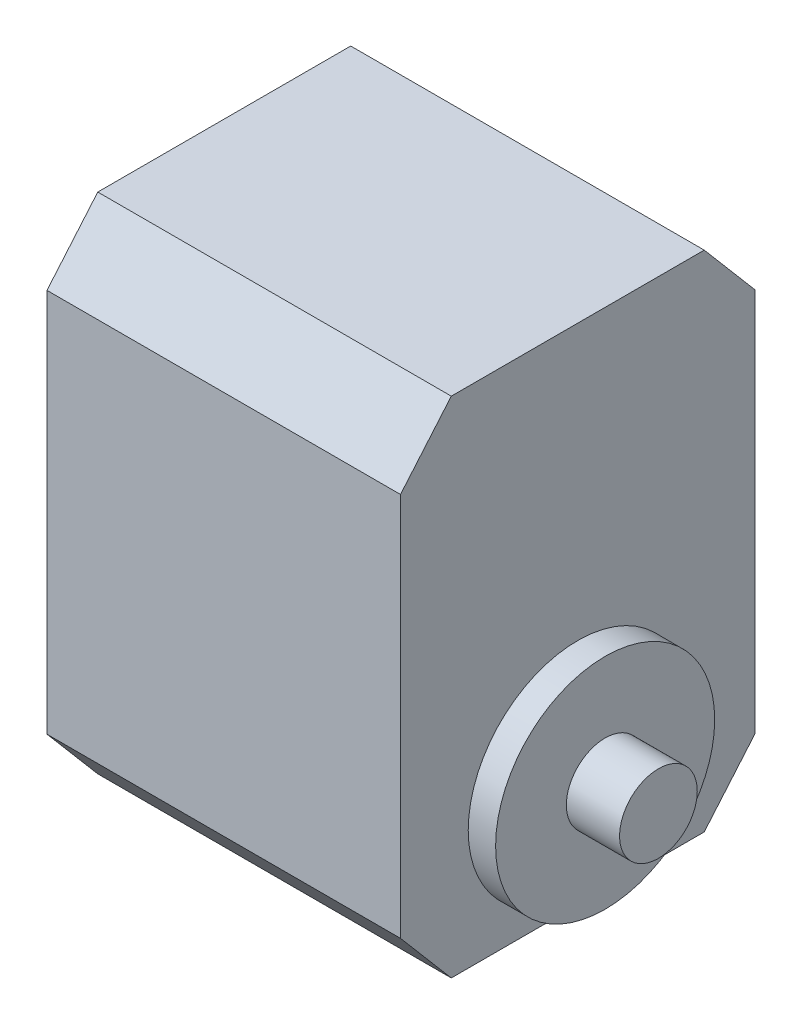
ISO-10303-21;
HEADER;
FILE_DESCRIPTION(('STEP AP214'),'2;1');
FILE_NAME('part.step','',(''),(''),'','','');
FILE_SCHEMA(('AUTOMOTIVE_DESIGN { 1 0 10303 214 1 1 1 1 }'));
ENDSEC;
DATA;
#1=APPLICATION_CONTEXT('core data for automotive mechanical design processes');
#2=APPLICATION_PROTOCOL_DEFINITION('international standard','automotive_design',2000,#1);
#3=PRODUCT_CONTEXT('',#1,'mechanical');
#4=PRODUCT('Part','Part','',(#3));
#5=PRODUCT_RELATED_PRODUCT_CATEGORY('part','',(#4));
#6=PRODUCT_DEFINITION_FORMATION('','',#4);
#7=PRODUCT_DEFINITION_CONTEXT('part definition',#1,'design');
#8=PRODUCT_DEFINITION('design','',#6,#7);
#9=PRODUCT_DEFINITION_SHAPE('','',#8);
#10=(LENGTH_UNIT() NAMED_UNIT(*) SI_UNIT(.MILLI.,.METRE.));
#11=(NAMED_UNIT(*) PLANE_ANGLE_UNIT() SI_UNIT($,.RADIAN.));
#12=(NAMED_UNIT(*) SI_UNIT($,.STERADIAN.) SOLID_ANGLE_UNIT());
#13=UNCERTAINTY_MEASURE_WITH_UNIT(LENGTH_MEASURE(1.E-05),#10,'distance_accuracy_value','');
#14=(GEOMETRIC_REPRESENTATION_CONTEXT(3) GLOBAL_UNCERTAINTY_ASSIGNED_CONTEXT((#13)) GLOBAL_UNIT_ASSIGNED_CONTEXT((#10,
#11,#12)) REPRESENTATION_CONTEXT('',''));
#15=CARTESIAN_POINT('',(0.,0.,0.));
#16=DIRECTION('',(0.,0.,1.));
#17=DIRECTION('',(1.,0.,0.));
#18=AXIS2_PLACEMENT_3D('',#15,#16,#17);
#19=CARTESIAN_POINT('',(17.75,38.6,17.8));
#20=DIRECTION('',(-1.,0.,0.));
#21=DIRECTION('',(0.,0.,1.));
#22=AXIS2_PLACEMENT_3D('',#19,#20,#21);
#23=PLANE('',#22);
#24=CARTESIAN_POINT('',(17.75,0.,0.));
#25=DIRECTION('',(-1.,0.,0.));
#26=DIRECTION('',(0.,0.,1.));
#27=AXIS2_PLACEMENT_3D('',#24,#25,#26);
#28=CIRCLE('',#27,11.);
#29=CARTESIAN_POINT('',(17.75,0.,11.));
#30=VERTEX_POINT('',#29);
#31=EDGE_CURVE('E128',#30,#30,#28,.F.);
#32=ORIENTED_EDGE('',*,*,#31,.F.);
#33=EDGE_LOOP('',(#32));
#34=FACE_BOUND('',#33,.T.);
#35=DIRECTION('',(0.,-0.76193931775946,0.64764842009554));
#36=VECTOR('',#35,1.);
#37=CARTESIAN_POINT('',(17.75,-12.,-12.7));
#38=LINE('',#37,#36);
#39=CARTESIAN_POINT('',(17.75,-5.99999999999998,-17.8));
#40=VERTEX_POINT('',#39);
#41=CARTESIAN_POINT('',(17.75,-12.,-12.7));
#42=VERTEX_POINT('',#41);
#43=EDGE_CURVE('E97',#40,#42,#38,.T.);
#44=ORIENTED_EDGE('',*,*,#43,.F.);
#45=DIRECTION('',(0.,-1.,0.));
#46=VECTOR('',#45,1.);
#47=CARTESIAN_POINT('',(17.75,38.6,-17.8));
#48=LINE('',#47,#46);
#49=CARTESIAN_POINT('',(17.75,32.6,-17.8));
#50=VERTEX_POINT('',#49);
#51=EDGE_CURVE('E107',#50,#40,#48,.T.);
#52=ORIENTED_EDGE('',*,*,#51,.F.);
#53=DIRECTION('',(0.,0.76193931775946,0.64764842009554));
#54=VECTOR('',#53,1.);
#55=CARTESIAN_POINT('',(17.75,38.6,-12.7));
#56=LINE('',#55,#54);
#57=CARTESIAN_POINT('',(17.75,38.6,-12.7));
#58=VERTEX_POINT('',#57);
#59=EDGE_CURVE('E144',#50,#58,#56,.T.);
#60=ORIENTED_EDGE('',*,*,#59,.T.);
#61=DIRECTION('',(0.,0.,-1.));
#62=VECTOR('',#61,1.);
#63=CARTESIAN_POINT('',(17.75,38.6,17.8));
#64=LINE('',#63,#62);
#65=CARTESIAN_POINT('',(17.75,38.6,12.7));
#66=VERTEX_POINT('',#65);
#67=EDGE_CURVE('E122',#66,#58,#64,.T.);
#68=ORIENTED_EDGE('',*,*,#67,.F.);
#69=DIRECTION('',(0.,-0.76193931775946,0.64764842009554));
#70=VECTOR('',#69,1.);
#71=CARTESIAN_POINT('',(17.75,38.6,12.7));
#72=LINE('',#71,#70);
#73=CARTESIAN_POINT('',(17.75,32.6,17.8));
#74=VERTEX_POINT('',#73);
#75=EDGE_CURVE('E142',#66,#74,#72,.T.);
#76=ORIENTED_EDGE('',*,*,#75,.T.);
#77=DIRECTION('',(0.,-1.,0.));
#78=VECTOR('',#77,1.);
#79=CARTESIAN_POINT('',(17.75,38.6,17.8));
#80=LINE('',#79,#78);
#81=CARTESIAN_POINT('',(17.75,-5.99999999999998,17.8));
#82=VERTEX_POINT('',#81);
#83=EDGE_CURVE('E116',#74,#82,#80,.T.);
#84=ORIENTED_EDGE('',*,*,#83,.T.);
#85=DIRECTION('',(0.,0.76193931775946,0.64764842009554));
#86=VECTOR('',#85,1.);
#87=CARTESIAN_POINT('',(17.75,-12.,12.7));
#88=LINE('',#87,#86);
#89=CARTESIAN_POINT('',(17.75,-12.,12.7));
#90=VERTEX_POINT('',#89);
#91=EDGE_CURVE('E190',#90,#82,#88,.T.);
#92=ORIENTED_EDGE('',*,*,#91,.F.);
#93=DIRECTION('',(0.,0.,-1.));
#94=VECTOR('',#93,1.);
#95=CARTESIAN_POINT('',(17.75,-12.,17.8));
#96=LINE('',#95,#94);
#97=EDGE_CURVE('E111',#90,#42,#96,.T.);
#98=ORIENTED_EDGE('',*,*,#97,.T.);
#99=EDGE_LOOP('',(#44,#52,#60,#68,#76,#84,#92,#98));
#100=FACE_BOUND('',#99,.T.);
#101=ADVANCED_FACE('F31',(#34,#100),#23,.F.);
#102=CARTESIAN_POINT('',(-17.75,38.6,17.8));
#103=DIRECTION('',(1.,0.,0.));
#104=DIRECTION('',(0.,0.,-1.));
#105=AXIS2_PLACEMENT_3D('',#102,#103,#104);
#106=PLANE('',#105);
#107=CARTESIAN_POINT('',(-17.75,0.,0.));
#108=DIRECTION('',(1.,0.,0.));
#109=DIRECTION('',(0.,0.,-1.));
#110=AXIS2_PLACEMENT_3D('',#107,#108,#109);
#111=CIRCLE('',#110,11.);
#112=CARTESIAN_POINT('',(-17.75,0.,-11.));
#113=VERTEX_POINT('',#112);
#114=EDGE_CURVE('E180',#113,#113,#111,.T.);
#115=ORIENTED_EDGE('',*,*,#114,.T.);
#116=EDGE_LOOP('',(#115));
#117=FACE_BOUND('',#116,.T.);
#118=DIRECTION('',(0.,0.76193931775946,-0.64764842009554));
#119=VECTOR('',#118,1.);
#120=CARTESIAN_POINT('',(-17.75,-12.,-12.7));
#121=LINE('',#120,#119);
#122=CARTESIAN_POINT('',(-17.75,-12.,-12.7));
#123=VERTEX_POINT('',#122);
#124=CARTESIAN_POINT('',(-17.75,-5.99999999999998,-17.8));
#125=VERTEX_POINT('',#124);
#126=EDGE_CURVE('E46',#123,#125,#121,.T.);
#127=ORIENTED_EDGE('',*,*,#126,.F.);
#128=DIRECTION('',(0.,0.,1.));
#129=VECTOR('',#128,1.);
#130=CARTESIAN_POINT('',(-17.75,-12.,17.8));
#131=LINE('',#130,#129);
#132=CARTESIAN_POINT('',(-17.75,-12.,12.7));
#133=VERTEX_POINT('',#132);
#134=EDGE_CURVE('E53',#123,#133,#131,.T.);
#135=ORIENTED_EDGE('',*,*,#134,.T.);
#136=DIRECTION('',(0.,-0.76193931775946,-0.64764842009554));
#137=VECTOR('',#136,1.);
#138=CARTESIAN_POINT('',(-17.75,-12.,12.7));
#139=LINE('',#138,#137);
#140=CARTESIAN_POINT('',(-17.75,-5.99999999999998,17.8));
#141=VERTEX_POINT('',#140);
#142=EDGE_CURVE('E156',#141,#133,#139,.T.);
#143=ORIENTED_EDGE('',*,*,#142,.F.);
#144=DIRECTION('',(0.,-1.,0.));
#145=VECTOR('',#144,1.);
#146=CARTESIAN_POINT('',(-17.75,38.6,17.8));
#147=LINE('',#146,#145);
#148=CARTESIAN_POINT('',(-17.75,32.6,17.8));
#149=VERTEX_POINT('',#148);
#150=EDGE_CURVE('E120',#149,#141,#147,.T.);
#151=ORIENTED_EDGE('',*,*,#150,.F.);
#152=DIRECTION('',(0.,0.76193931775946,-0.64764842009554));
#153=VECTOR('',#152,1.);
#154=CARTESIAN_POINT('',(-17.75,38.6,12.7));
#155=LINE('',#154,#153);
#156=CARTESIAN_POINT('',(-17.75,38.6,12.7));
#157=VERTEX_POINT('',#156);
#158=EDGE_CURVE('E137',#149,#157,#155,.T.);
#159=ORIENTED_EDGE('',*,*,#158,.T.);
#160=DIRECTION('',(0.,0.,1.));
#161=VECTOR('',#160,1.);
#162=CARTESIAN_POINT('',(-17.75,38.6,17.8));
#163=LINE('',#162,#161);
#164=CARTESIAN_POINT('',(-17.75,38.6,-12.7));
#165=VERTEX_POINT('',#164);
#166=EDGE_CURVE('E163',#165,#157,#163,.T.);
#167=ORIENTED_EDGE('',*,*,#166,.F.);
#168=DIRECTION('',(0.,-0.76193931775946,-0.64764842009554));
#169=VECTOR('',#168,1.);
#170=CARTESIAN_POINT('',(-17.75,38.6,-12.7));
#171=LINE('',#170,#169);
#172=CARTESIAN_POINT('',(-17.75,32.6,-17.8));
#173=VERTEX_POINT('',#172);
#174=EDGE_CURVE('E139',#165,#173,#171,.T.);
#175=ORIENTED_EDGE('',*,*,#174,.T.);
#176=DIRECTION('',(0.,-1.,0.));
#177=VECTOR('',#176,1.);
#178=CARTESIAN_POINT('',(-17.75,38.6,-17.8));
#179=LINE('',#178,#177);
#180=EDGE_CURVE('E117',#173,#125,#179,.T.);
#181=ORIENTED_EDGE('',*,*,#180,.T.);
#182=EDGE_LOOP('',(#127,#135,#143,#151,#159,#167,#175,#181));
#183=FACE_BOUND('',#182,.T.);
#184=ADVANCED_FACE('F153',(#117,#183),#106,.F.);
#185=CARTESIAN_POINT('',(-17.75,-12.,-17.8));
#186=DIRECTION('',(0.,1.,0.));
#187=DIRECTION('',(0.,0.,1.));
#188=AXIS2_PLACEMENT_3D('',#185,#186,#187);
#189=PLANE('',#188);
#190=DIRECTION('',(-1.,0.,0.));
#191=VECTOR('',#190,1.);
#192=CARTESIAN_POINT('',(-17.75,-12.,-12.7));
#193=LINE('',#192,#191);
#194=EDGE_CURVE('E195',#42,#123,#193,.T.);
#195=ORIENTED_EDGE('',*,*,#194,.F.);
#196=ORIENTED_EDGE('',*,*,#97,.F.);
#197=DIRECTION('',(1.,0.,0.));
#198=VECTOR('',#197,1.);
#199=CARTESIAN_POINT('',(17.75,-12.,12.7));
#200=LINE('',#199,#198);
#201=EDGE_CURVE('E188',#133,#90,#200,.T.);
#202=ORIENTED_EDGE('',*,*,#201,.F.);
#203=ORIENTED_EDGE('',*,*,#134,.F.);
#204=EDGE_LOOP('',(#195,#196,#202,#203));
#205=FACE_BOUND('',#204,.T.);
#206=ADVANCED_FACE('F199',(#205),#189,.F.);
#207=CARTESIAN_POINT('',(17.75,38.6,-17.8));
#208=DIRECTION('',(0.,0.,1.));
#209=DIRECTION('',(1.,0.,0.));
#210=AXIS2_PLACEMENT_3D('',#207,#208,#209);
#211=PLANE('',#210);
#212=DIRECTION('',(1.,0.,0.));
#213=VECTOR('',#212,1.);
#214=CARTESIAN_POINT('',(17.75,-5.99999999999998,-17.8));
#215=LINE('',#214,#213);
#216=EDGE_CURVE('E94',#125,#40,#215,.T.);
#217=ORIENTED_EDGE('',*,*,#216,.F.);
#218=ORIENTED_EDGE('',*,*,#180,.F.);
#219=DIRECTION('',(1.,0.,0.));
#220=VECTOR('',#219,1.);
#221=CARTESIAN_POINT('',(17.75,32.6,-17.8));
#222=LINE('',#221,#220);
#223=EDGE_CURVE('E115',#173,#50,#222,.T.);
#224=ORIENTED_EDGE('',*,*,#223,.T.);
#225=ORIENTED_EDGE('',*,*,#51,.T.);
#226=EDGE_LOOP('',(#217,#218,#224,#225));
#227=FACE_BOUND('',#226,.T.);
#228=ADVANCED_FACE('F113',(#227),#211,.F.);
#229=CARTESIAN_POINT('',(17.75,38.6,17.8));
#230=DIRECTION('',(0.,0.,-1.));
#231=DIRECTION('',(-1.,0.,0.));
#232=AXIS2_PLACEMENT_3D('',#229,#230,#231);
#233=PLANE('',#232);
#234=DIRECTION('',(-1.,0.,0.));
#235=VECTOR('',#234,1.);
#236=CARTESIAN_POINT('',(-17.75,-5.99999999999998,17.8));
#237=LINE('',#236,#235);
#238=EDGE_CURVE('E192',#82,#141,#237,.T.);
#239=ORIENTED_EDGE('',*,*,#238,.F.);
#240=ORIENTED_EDGE('',*,*,#83,.F.);
#241=DIRECTION('',(-1.,0.,0.));
#242=VECTOR('',#241,1.);
#243=CARTESIAN_POINT('',(-17.75,32.6,17.8));
#244=LINE('',#243,#242);
#245=EDGE_CURVE('E39',#74,#149,#244,.T.);
#246=ORIENTED_EDGE('',*,*,#245,.T.);
#247=ORIENTED_EDGE('',*,*,#150,.T.);
#248=EDGE_LOOP('',(#239,#240,#246,#247));
#249=FACE_BOUND('',#248,.T.);
#250=ADVANCED_FACE('F150',(#249),#233,.F.);
#251=CARTESIAN_POINT('',(20.5,0.,0.));
#252=DIRECTION('',(1.,0.,0.));
#253=DIRECTION('',(0.,0.,-1.));
#254=AXIS2_PLACEMENT_3D('',#251,#252,#253);
#255=PLANE('',#254);
#256=CARTESIAN_POINT('',(20.5,0.,0.));
#257=DIRECTION('',(1.,0.,0.));
#258=DIRECTION('',(0.,0.,-1.));
#259=AXIS2_PLACEMENT_3D('',#256,#257,#258);
#260=CIRCLE('',#259,11.);
#261=CARTESIAN_POINT('',(20.5,0.,-11.));
#262=VERTEX_POINT('',#261);
#263=EDGE_CURVE('E168',#262,#262,#260,.T.);
#264=ORIENTED_EDGE('',*,*,#263,.T.);
#265=EDGE_LOOP('',(#264));
#266=FACE_BOUND('',#265,.T.);
#267=CARTESIAN_POINT('',(20.5,0.,0.));
#268=DIRECTION('',(1.,0.,0.));
#269=DIRECTION('',(0.,0.,-1.));
#270=AXIS2_PLACEMENT_3D('',#267,#268,#269);
#271=CIRCLE('',#270,3.90000000000001);
#272=CARTESIAN_POINT('',(20.5,0.,-3.90000000000001));
#273=VERTEX_POINT('',#272);
#274=EDGE_CURVE('E174',#273,#273,#271,.T.);
#275=ORIENTED_EDGE('',*,*,#274,.F.);
#276=EDGE_LOOP('',(#275));
#277=FACE_BOUND('',#276,.T.);
#278=ADVANCED_FACE('F226',(#266,#277),#255,.T.);
#279=CARTESIAN_POINT('',(-17.75,38.6,-17.8));
#280=DIRECTION('',(0.,1.,0.));
#281=DIRECTION('',(0.,0.,1.));
#282=AXIS2_PLACEMENT_3D('',#279,#280,#281);
#283=PLANE('',#282);
#284=ORIENTED_EDGE('',*,*,#67,.T.);
#285=DIRECTION('',(-1.,0.,0.));
#286=VECTOR('',#285,1.);
#287=CARTESIAN_POINT('',(-17.75,38.6,-12.7));
#288=LINE('',#287,#286);
#289=EDGE_CURVE('E134',#58,#165,#288,.T.);
#290=ORIENTED_EDGE('',*,*,#289,.T.);
#291=ORIENTED_EDGE('',*,*,#166,.T.);
#292=DIRECTION('',(1.,0.,0.));
#293=VECTOR('',#292,1.);
#294=CARTESIAN_POINT('',(17.75,38.6,12.7));
#295=LINE('',#294,#293);
#296=EDGE_CURVE('E131',#157,#66,#295,.T.);
#297=ORIENTED_EDGE('',*,*,#296,.T.);
#298=EDGE_LOOP('',(#284,#290,#291,#297));
#299=FACE_BOUND('',#298,.T.);
#300=ADVANCED_FACE('F161',(#299),#283,.T.);
#301=CARTESIAN_POINT('',(20.5,0.,0.));
#302=DIRECTION('',(-1.,0.,0.));
#303=DIRECTION('',(0.,0.,1.));
#304=AXIS2_PLACEMENT_3D('',#301,#302,#303);
#305=CYLINDRICAL_SURFACE('',#304,11.);
#306=ORIENTED_EDGE('',*,*,#263,.F.);
#307=EDGE_LOOP('',(#306));
#308=FACE_BOUND('',#307,.T.);
#309=ORIENTED_EDGE('',*,*,#31,.T.);
#310=EDGE_LOOP('',(#309));
#311=FACE_BOUND('',#310,.T.);
#312=ADVANCED_FACE('F242',(#308,#311),#305,.T.);
#313=CARTESIAN_POINT('',(25.85,0.,0.));
#314=DIRECTION('',(-1.,0.,0.));
#315=DIRECTION('',(0.,0.,1.));
#316=AXIS2_PLACEMENT_3D('',#313,#314,#315);
#317=CYLINDRICAL_SURFACE('',#316,3.90000000000001);
#318=CARTESIAN_POINT('',(25.85,0.,0.));
#319=DIRECTION('',(1.,0.,0.));
#320=DIRECTION('',(0.,0.,-1.));
#321=AXIS2_PLACEMENT_3D('',#318,#319,#320);
#322=CIRCLE('',#321,3.90000000000001);
#323=CARTESIAN_POINT('',(25.85,0.,-3.90000000000001));
#324=VERTEX_POINT('',#323);
#325=EDGE_CURVE('E170',#324,#324,#322,.T.);
#326=ORIENTED_EDGE('',*,*,#325,.F.);
#327=EDGE_LOOP('',(#326));
#328=FACE_BOUND('',#327,.T.);
#329=ORIENTED_EDGE('',*,*,#274,.T.);
#330=EDGE_LOOP('',(#329));
#331=FACE_BOUND('',#330,.T.);
#332=ADVANCED_FACE('F236',(#328,#331),#317,.T.);
#333=CARTESIAN_POINT('',(25.85,0.,0.));
#334=DIRECTION('',(1.,0.,0.));
#335=DIRECTION('',(0.,0.,-1.));
#336=AXIS2_PLACEMENT_3D('',#333,#334,#335);
#337=PLANE('',#336);
#338=ORIENTED_EDGE('',*,*,#325,.T.);
#339=EDGE_LOOP('',(#338));
#340=FACE_BOUND('',#339,.T.);
#341=ADVANCED_FACE('F229',(#340),#337,.T.);
#342=CARTESIAN_POINT('',(-17.75,38.6,-12.7));
#343=DIRECTION('',(0.,0.64764842009554,-0.761939317759459));
#344=DIRECTION('',(0.,0.76193931775946,0.64764842009554));
#345=AXIS2_PLACEMENT_3D('',#342,#343,#344);
#346=PLANE('',#345);
#347=ORIENTED_EDGE('',*,*,#59,.F.);
#348=ORIENTED_EDGE('',*,*,#223,.F.);
#349=ORIENTED_EDGE('',*,*,#174,.F.);
#350=ORIENTED_EDGE('',*,*,#289,.F.);
#351=EDGE_LOOP('',(#347,#348,#349,#350));
#352=FACE_BOUND('',#351,.T.);
#353=ADVANCED_FACE('F227',(#352),#346,.T.);
#354=CARTESIAN_POINT('',(-17.75,38.6,12.7));
#355=DIRECTION('',(0.,0.64764842009554,0.761939317759459));
#356=DIRECTION('',(0.,-0.76193931775946,0.64764842009554));
#357=AXIS2_PLACEMENT_3D('',#354,#355,#356);
#358=PLANE('',#357);
#359=ORIENTED_EDGE('',*,*,#158,.F.);
#360=ORIENTED_EDGE('',*,*,#245,.F.);
#361=ORIENTED_EDGE('',*,*,#75,.F.);
#362=ORIENTED_EDGE('',*,*,#296,.F.);
#363=EDGE_LOOP('',(#359,#360,#361,#362));
#364=FACE_BOUND('',#363,.T.);
#365=ADVANCED_FACE('F33',(#364),#358,.T.);
#366=CARTESIAN_POINT('',(-20.5,0.,0.));
#367=DIRECTION('',(1.,0.,0.));
#368=DIRECTION('',(0.,0.,-1.));
#369=AXIS2_PLACEMENT_3D('',#366,#367,#368);
#370=CYLINDRICAL_SURFACE('',#369,11.);
#371=CARTESIAN_POINT('',(-20.5,0.,0.));
#372=DIRECTION('',(1.,0.,0.));
#373=DIRECTION('',(0.,0.,-1.));
#374=AXIS2_PLACEMENT_3D('',#371,#372,#373);
#375=CIRCLE('',#374,11.);
#376=CARTESIAN_POINT('',(-20.5,0.,-11.));
#377=VERTEX_POINT('',#376);
#378=EDGE_CURVE('E178',#377,#377,#375,.T.);
#379=ORIENTED_EDGE('',*,*,#378,.T.);
#380=EDGE_LOOP('',(#379));
#381=FACE_BOUND('',#380,.T.);
#382=ORIENTED_EDGE('',*,*,#114,.F.);
#383=EDGE_LOOP('',(#382));
#384=FACE_BOUND('',#383,.T.);
#385=ADVANCED_FACE('F235',(#381,#384),#370,.T.);
#386=CARTESIAN_POINT('',(-20.5,0.,0.));
#387=DIRECTION('',(-1.,0.,0.));
#388=DIRECTION('',(0.,0.,-1.));
#389=AXIS2_PLACEMENT_3D('',#386,#387,#388);
#390=PLANE('',#389);
#391=CARTESIAN_POINT('',(-20.5,0.,0.));
#392=DIRECTION('',(-1.,0.,0.));
#393=DIRECTION('',(0.,0.,1.));
#394=AXIS2_PLACEMENT_3D('',#391,#392,#393);
#395=CIRCLE('',#394,3.90000000000001);
#396=CARTESIAN_POINT('',(-20.5,0.,3.90000000000001));
#397=VERTEX_POINT('',#396);
#398=EDGE_CURVE('E11',#397,#397,#395,.T.);
#399=ORIENTED_EDGE('',*,*,#398,.F.);
#400=EDGE_LOOP('',(#399));
#401=FACE_BOUND('',#400,.T.);
#402=ORIENTED_EDGE('',*,*,#378,.F.);
#403=EDGE_LOOP('',(#402));
#404=FACE_BOUND('',#403,.T.);
#405=ADVANCED_FACE('F303',(#401,#404),#390,.T.);
#406=CARTESIAN_POINT('',(-25.85,0.,0.));
#407=DIRECTION('',(1.,0.,0.));
#408=DIRECTION('',(0.,0.,-1.));
#409=AXIS2_PLACEMENT_3D('',#406,#407,#408);
#410=CYLINDRICAL_SURFACE('',#409,3.90000000000001);
#411=CARTESIAN_POINT('',(-25.85,0.,0.));
#412=DIRECTION('',(1.,0.,0.));
#413=DIRECTION('',(0.,0.,-1.));
#414=AXIS2_PLACEMENT_3D('',#411,#412,#413);
#415=CIRCLE('',#414,3.90000000000001);
#416=CARTESIAN_POINT('',(-25.85,0.,-3.90000000000001));
#417=VERTEX_POINT('',#416);
#418=EDGE_CURVE('E183',#417,#417,#415,.T.);
#419=ORIENTED_EDGE('',*,*,#418,.T.);
#420=EDGE_LOOP('',(#419));
#421=FACE_BOUND('',#420,.T.);
#422=ORIENTED_EDGE('',*,*,#398,.T.);
#423=EDGE_LOOP('',(#422));
#424=FACE_BOUND('',#423,.T.);
#425=ADVANCED_FACE('F210',(#421,#424),#410,.T.);
#426=CARTESIAN_POINT('',(-25.85,0.,0.));
#427=DIRECTION('',(-1.,0.,0.));
#428=DIRECTION('',(0.,0.,-1.));
#429=AXIS2_PLACEMENT_3D('',#426,#427,#428);
#430=PLANE('',#429);
#431=ORIENTED_EDGE('',*,*,#418,.F.);
#432=EDGE_LOOP('',(#431));
#433=FACE_BOUND('',#432,.T.);
#434=ADVANCED_FACE('F203',(#433),#430,.T.);
#435=CARTESIAN_POINT('',(-17.75,-12.,12.7));
#436=DIRECTION('',(0.,-0.64764842009554,0.761939317759459));
#437=DIRECTION('',(0.,0.76193931775946,0.64764842009554));
#438=AXIS2_PLACEMENT_3D('',#435,#436,#437);
#439=PLANE('',#438);
#440=ORIENTED_EDGE('',*,*,#142,.T.);
#441=ORIENTED_EDGE('',*,*,#201,.T.);
#442=ORIENTED_EDGE('',*,*,#91,.T.);
#443=ORIENTED_EDGE('',*,*,#238,.T.);
#444=EDGE_LOOP('',(#440,#441,#442,#443));
#445=FACE_BOUND('',#444,.T.);
#446=ADVANCED_FACE('F201',(#445),#439,.T.);
#447=CARTESIAN_POINT('',(-17.75,-12.,-12.7));
#448=DIRECTION('',(0.,-0.64764842009554,-0.761939317759459));
#449=DIRECTION('',(0.,-0.76193931775946,0.64764842009554));
#450=AXIS2_PLACEMENT_3D('',#447,#448,#449);
#451=PLANE('',#450);
#452=ORIENTED_EDGE('',*,*,#43,.T.);
#453=ORIENTED_EDGE('',*,*,#194,.T.);
#454=ORIENTED_EDGE('',*,*,#126,.T.);
#455=ORIENTED_EDGE('',*,*,#216,.T.);
#456=EDGE_LOOP('',(#452,#453,#454,#455));
#457=FACE_BOUND('',#456,.T.);
#458=ADVANCED_FACE('F96',(#457),#451,.T.);
#459=CLOSED_SHELL('',(#101,#184,#206,#228,#250,#278,#300,#312,#332,#341,#353,#365,#385,#405,
#425,#434,#446,#458));
#460=MANIFOLD_SOLID_BREP('B2',#459);
#461=ADVANCED_BREP_SHAPE_REPRESENTATION('',(#18,#460),#14);
#462=SHAPE_DEFINITION_REPRESENTATION(#9,#461);
ENDSEC;
END-ISO-10303-21;
